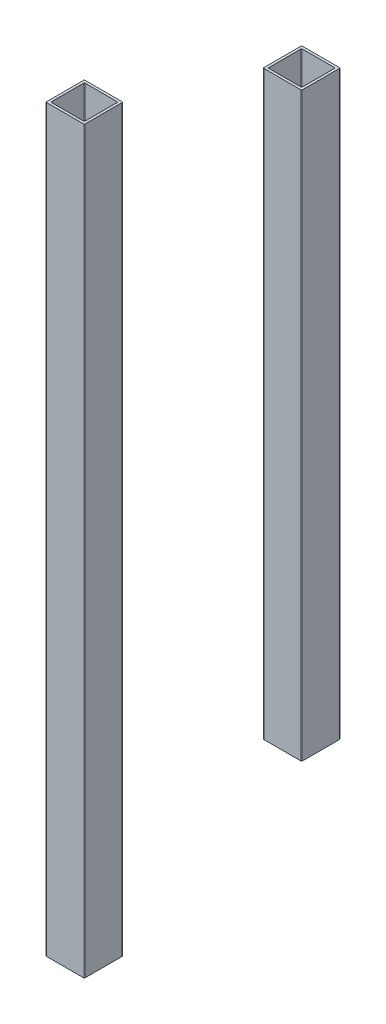
ISO-10303-21;
HEADER;
FILE_DESCRIPTION(('STEP AP214'),'2;1');
FILE_NAME('part.step','',(''),(''),'','','');
FILE_SCHEMA(('AUTOMOTIVE_DESIGN { 1 0 10303 214 1 1 1 1 }'));
ENDSEC;
DATA;
#1=APPLICATION_CONTEXT('core data for automotive mechanical design processes');
#2=APPLICATION_PROTOCOL_DEFINITION('international standard','automotive_design',2000,#1);
#3=PRODUCT_CONTEXT('',#1,'mechanical');
#4=PRODUCT('Part','Part','',(#3));
#5=PRODUCT_RELATED_PRODUCT_CATEGORY('part','',(#4));
#6=PRODUCT_DEFINITION_FORMATION('','',#4);
#7=PRODUCT_DEFINITION_CONTEXT('part definition',#1,'design');
#8=PRODUCT_DEFINITION('design','',#6,#7);
#9=PRODUCT_DEFINITION_SHAPE('','',#8);
#10=(LENGTH_UNIT() NAMED_UNIT(*) SI_UNIT(.MILLI.,.METRE.));
#11=(NAMED_UNIT(*) PLANE_ANGLE_UNIT() SI_UNIT($,.RADIAN.));
#12=(NAMED_UNIT(*) SI_UNIT($,.STERADIAN.) SOLID_ANGLE_UNIT());
#13=UNCERTAINTY_MEASURE_WITH_UNIT(LENGTH_MEASURE(1.E-05),#10,'distance_accuracy_value','');
#14=(GEOMETRIC_REPRESENTATION_CONTEXT(3) GLOBAL_UNCERTAINTY_ASSIGNED_CONTEXT((#13)) GLOBAL_UNIT_ASSIGNED_CONTEXT((#10,
#11,#12)) REPRESENTATION_CONTEXT('',''));
#15=CARTESIAN_POINT('',(0.,0.,0.));
#16=DIRECTION('',(0.,0.,1.));
#17=DIRECTION('',(1.,0.,0.));
#18=AXIS2_PLACEMENT_3D('',#15,#16,#17);
#19=CARTESIAN_POINT('',(-696.341,243.726115798,198.466817696));
#20=DIRECTION('',(0.,-1.,0.));
#21=DIRECTION('',(0.,0.,-1.));
#22=AXIS2_PLACEMENT_3D('',#19,#20,#21);
#23=CYLINDRICAL_SURFACE('',#22,0.507999999999974);
#24=CARTESIAN_POINT('',(-696.341,-243.726115798,198.466817696));
#25=DIRECTION('',(0.,1.,0.));
#26=DIRECTION('',(0.,0.,-1.));
#27=AXIS2_PLACEMENT_3D('',#24,#25,#26);
#28=CIRCLE('',#27,0.507999999999974);
#29=CARTESIAN_POINT('',(-696.341,-243.726115798,197.958817696));
#30=VERTEX_POINT('',#29);
#31=CARTESIAN_POINT('',(-696.849,-243.726115798,198.466817696));
#32=VERTEX_POINT('',#31);
#33=EDGE_CURVE('E240',#30,#32,#28,.T.);
#34=ORIENTED_EDGE('',*,*,#33,.F.);
#35=DIRECTION('',(0.,-1.,0.));
#36=VECTOR('',#35,1.);
#37=CARTESIAN_POINT('',(-696.341,243.726115798,197.958817696));
#38=LINE('',#37,#36);
#39=CARTESIAN_POINT('',(-696.341,243.726115798,197.958817696));
#40=VERTEX_POINT('',#39);
#41=EDGE_CURVE('E13',#40,#30,#38,.T.);
#42=ORIENTED_EDGE('',*,*,#41,.F.);
#43=CARTESIAN_POINT('',(-696.341,243.726115798,198.466817696));
#44=DIRECTION('',(0.,1.,0.));
#45=DIRECTION('',(0.,0.,-1.));
#46=AXIS2_PLACEMENT_3D('',#43,#44,#45);
#47=CIRCLE('',#46,0.507999999999974);
#48=CARTESIAN_POINT('',(-696.849,243.726115798,198.466817696));
#49=VERTEX_POINT('',#48);
#50=EDGE_CURVE('E325',#40,#49,#47,.T.);
#51=ORIENTED_EDGE('',*,*,#50,.T.);
#52=DIRECTION('',(0.,-1.,0.));
#53=VECTOR('',#52,1.);
#54=CARTESIAN_POINT('',(-696.849,243.726115798,198.466817696));
#55=LINE('',#54,#53);
#56=EDGE_CURVE('E92',#49,#32,#55,.T.);
#57=ORIENTED_EDGE('',*,*,#56,.T.);
#58=EDGE_LOOP('',(#34,#42,#51,#57));
#59=FACE_BOUND('',#58,.T.);
#60=ADVANCED_FACE('F73',(#59),#23,.F.);
#61=CARTESIAN_POINT('',(-675.259,243.726115798,197.958817696));
#62=DIRECTION('',(0.,0.,1.));
#63=DIRECTION('',(1.,0.,0.));
#64=AXIS2_PLACEMENT_3D('',#61,#62,#63);
#65=PLANE('',#64);
#66=DIRECTION('',(-1.,0.,0.));
#67=VECTOR('',#66,1.);
#68=CARTESIAN_POINT('',(-675.259,-243.726115798,197.958817696));
#69=LINE('',#68,#67);
#70=CARTESIAN_POINT('',(-675.259,-243.726115798,197.958817696));
#71=VERTEX_POINT('',#70);
#72=EDGE_CURVE('E242',#71,#30,#69,.T.);
#73=ORIENTED_EDGE('',*,*,#72,.F.);
#74=DIRECTION('',(0.,-1.,0.));
#75=VECTOR('',#74,1.);
#76=CARTESIAN_POINT('',(-675.259,243.726115798,197.958817696));
#77=LINE('',#76,#75);
#78=CARTESIAN_POINT('',(-675.259,243.726115798,197.958817696));
#79=VERTEX_POINT('',#78);
#80=EDGE_CURVE('E83',#79,#71,#77,.T.);
#81=ORIENTED_EDGE('',*,*,#80,.F.);
#82=DIRECTION('',(-1.,0.,0.));
#83=VECTOR('',#82,1.);
#84=CARTESIAN_POINT('',(-675.259,243.726115798,197.958817696));
#85=LINE('',#84,#83);
#86=EDGE_CURVE('E327',#79,#40,#85,.T.);
#87=ORIENTED_EDGE('',*,*,#86,.T.);
#88=ORIENTED_EDGE('',*,*,#41,.T.);
#89=EDGE_LOOP('',(#73,#81,#87,#88));
#90=FACE_BOUND('',#89,.T.);
#91=ADVANCED_FACE('F354',(#90),#65,.T.);
#92=CARTESIAN_POINT('',(-675.259,243.726115798,198.466817696));
#93=DIRECTION('',(0.,-1.,0.));
#94=DIRECTION('',(0.,0.,-1.));
#95=AXIS2_PLACEMENT_3D('',#92,#93,#94);
#96=CYLINDRICAL_SURFACE('',#95,0.507999999999974);
#97=CARTESIAN_POINT('',(-675.259,-243.726115798,198.466817696));
#98=DIRECTION('',(0.,1.,0.));
#99=DIRECTION('',(0.,0.,1.));
#100=AXIS2_PLACEMENT_3D('',#97,#98,#99);
#101=CIRCLE('',#100,0.507999999999974);
#102=CARTESIAN_POINT('',(-674.751,-243.726115798,198.466817696));
#103=VERTEX_POINT('',#102);
#104=EDGE_CURVE('E245',#103,#71,#101,.T.);
#105=ORIENTED_EDGE('',*,*,#104,.F.);
#106=DIRECTION('',(0.,-1.,0.));
#107=VECTOR('',#106,1.);
#108=CARTESIAN_POINT('',(-674.751,243.726115798,198.466817696));
#109=LINE('',#108,#107);
#110=CARTESIAN_POINT('',(-674.751,243.726115798,198.466817696));
#111=VERTEX_POINT('',#110);
#112=EDGE_CURVE('E266',#111,#103,#109,.T.);
#113=ORIENTED_EDGE('',*,*,#112,.F.);
#114=CARTESIAN_POINT('',(-675.259,243.726115798,198.466817696));
#115=DIRECTION('',(0.,1.,0.));
#116=DIRECTION('',(0.,0.,1.));
#117=AXIS2_PLACEMENT_3D('',#114,#115,#116);
#118=CIRCLE('',#117,0.507999999999974);
#119=EDGE_CURVE('E330',#111,#79,#118,.T.);
#120=ORIENTED_EDGE('',*,*,#119,.T.);
#121=ORIENTED_EDGE('',*,*,#80,.T.);
#122=EDGE_LOOP('',(#105,#113,#120,#121));
#123=FACE_BOUND('',#122,.T.);
#124=ADVANCED_FACE('F359',(#123),#96,.F.);
#125=CARTESIAN_POINT('',(-674.751,243.726115798,219.548817696));
#126=DIRECTION('',(-1.,0.,0.));
#127=DIRECTION('',(0.,0.,1.));
#128=AXIS2_PLACEMENT_3D('',#125,#126,#127);
#129=PLANE('',#128);
#130=DIRECTION('',(0.,0.,-1.));
#131=VECTOR('',#130,1.);
#132=CARTESIAN_POINT('',(-674.751,-243.726115798,219.548817696));
#133=LINE('',#132,#131);
#134=CARTESIAN_POINT('',(-674.751,-243.726115798,219.548817696));
#135=VERTEX_POINT('',#134);
#136=EDGE_CURVE('E248',#135,#103,#133,.T.);
#137=ORIENTED_EDGE('',*,*,#136,.F.);
#138=DIRECTION('',(0.,-1.,0.));
#139=VECTOR('',#138,1.);
#140=CARTESIAN_POINT('',(-674.751,243.726115798,219.548817696));
#141=LINE('',#140,#139);
#142=CARTESIAN_POINT('',(-674.751,243.726115798,219.548817696));
#143=VERTEX_POINT('',#142);
#144=EDGE_CURVE('E264',#143,#135,#141,.T.);
#145=ORIENTED_EDGE('',*,*,#144,.F.);
#146=DIRECTION('',(0.,0.,-1.));
#147=VECTOR('',#146,1.);
#148=CARTESIAN_POINT('',(-674.751,243.726115798,219.548817696));
#149=LINE('',#148,#147);
#150=EDGE_CURVE('E333',#143,#111,#149,.T.);
#151=ORIENTED_EDGE('',*,*,#150,.T.);
#152=ORIENTED_EDGE('',*,*,#112,.T.);
#153=EDGE_LOOP('',(#137,#145,#151,#152));
#154=FACE_BOUND('',#153,.T.);
#155=ADVANCED_FACE('F392',(#154),#129,.T.);
#156=CARTESIAN_POINT('',(-675.259,243.726115798,219.548817696));
#157=DIRECTION('',(0.,-1.,0.));
#158=DIRECTION('',(0.,0.,-1.));
#159=AXIS2_PLACEMENT_3D('',#156,#157,#158);
#160=CYLINDRICAL_SURFACE('',#159,0.507999999999974);
#161=CARTESIAN_POINT('',(-675.259,-243.726115798,219.548817696));
#162=DIRECTION('',(0.,1.,0.));
#163=DIRECTION('',(0.,0.,-1.));
#164=AXIS2_PLACEMENT_3D('',#161,#162,#163);
#165=CIRCLE('',#164,0.507999999999974);
#166=CARTESIAN_POINT('',(-675.259,-243.726115798,220.056817696));
#167=VERTEX_POINT('',#166);
#168=EDGE_CURVE('E251',#167,#135,#165,.T.);
#169=ORIENTED_EDGE('',*,*,#168,.F.);
#170=DIRECTION('',(0.,-1.,0.));
#171=VECTOR('',#170,1.);
#172=CARTESIAN_POINT('',(-675.259,243.726115798,220.056817696));
#173=LINE('',#172,#171);
#174=CARTESIAN_POINT('',(-675.259,243.726115798,220.056817696));
#175=VERTEX_POINT('',#174);
#176=EDGE_CURVE('E203',#175,#167,#173,.T.);
#177=ORIENTED_EDGE('',*,*,#176,.F.);
#178=CARTESIAN_POINT('',(-675.259,243.726115798,219.548817696));
#179=DIRECTION('',(0.,1.,0.));
#180=DIRECTION('',(0.,0.,-1.));
#181=AXIS2_PLACEMENT_3D('',#178,#179,#180);
#182=CIRCLE('',#181,0.507999999999974);
#183=EDGE_CURVE('E214',#175,#143,#182,.T.);
#184=ORIENTED_EDGE('',*,*,#183,.T.);
#185=ORIENTED_EDGE('',*,*,#144,.T.);
#186=EDGE_LOOP('',(#169,#177,#184,#185));
#187=FACE_BOUND('',#186,.T.);
#188=ADVANCED_FACE('F337',(#187),#160,.F.);
#189=CARTESIAN_POINT('',(-675.259,243.726115798,220.056817696));
#190=DIRECTION('',(0.,0.,-1.));
#191=DIRECTION('',(-1.,0.,0.));
#192=AXIS2_PLACEMENT_3D('',#189,#190,#191);
#193=PLANE('',#192);
#194=DIRECTION('',(1.,0.,0.));
#195=VECTOR('',#194,1.);
#196=CARTESIAN_POINT('',(-675.259,-243.726115798,220.056817696));
#197=LINE('',#196,#195);
#198=CARTESIAN_POINT('',(-696.341,-243.726115798,220.056817696));
#199=VERTEX_POINT('',#198);
#200=EDGE_CURVE('E199',#199,#167,#197,.T.);
#201=ORIENTED_EDGE('',*,*,#200,.F.);
#202=DIRECTION('',(0.,-1.,0.));
#203=VECTOR('',#202,1.);
#204=CARTESIAN_POINT('',(-696.341,243.726115798,220.056817696));
#205=LINE('',#204,#203);
#206=CARTESIAN_POINT('',(-696.341,243.726115798,220.056817696));
#207=VERTEX_POINT('',#206);
#208=EDGE_CURVE('E194',#207,#199,#205,.T.);
#209=ORIENTED_EDGE('',*,*,#208,.F.);
#210=DIRECTION('',(1.,0.,0.));
#211=VECTOR('',#210,1.);
#212=CARTESIAN_POINT('',(-675.259,243.726115798,220.056817696));
#213=LINE('',#212,#211);
#214=EDGE_CURVE('E197',#207,#175,#213,.T.);
#215=ORIENTED_EDGE('',*,*,#214,.T.);
#216=ORIENTED_EDGE('',*,*,#176,.T.);
#217=EDGE_LOOP('',(#201,#209,#215,#216));
#218=FACE_BOUND('',#217,.T.);
#219=ADVANCED_FACE('F196',(#218),#193,.T.);
#220=CARTESIAN_POINT('',(-696.341,243.726115798,219.548817696));
#221=DIRECTION('',(0.,-1.,0.));
#222=DIRECTION('',(0.,0.,-1.));
#223=AXIS2_PLACEMENT_3D('',#220,#221,#222);
#224=CYLINDRICAL_SURFACE('',#223,0.507999999999977);
#225=CARTESIAN_POINT('',(-696.341,-243.726115798,219.548817696));
#226=DIRECTION('',(0.,1.,0.));
#227=DIRECTION('',(0.,0.,-1.));
#228=AXIS2_PLACEMENT_3D('',#225,#226,#227);
#229=CIRCLE('',#228,0.507999999999977);
#230=CARTESIAN_POINT('',(-696.849,-243.726115798,219.548817696));
#231=VERTEX_POINT('',#230);
#232=EDGE_CURVE('E255',#231,#199,#229,.T.);
#233=ORIENTED_EDGE('',*,*,#232,.F.);
#234=DIRECTION('',(0.,-1.,0.));
#235=VECTOR('',#234,1.);
#236=CARTESIAN_POINT('',(-696.849,243.726115798,219.548817696));
#237=LINE('',#236,#235);
#238=CARTESIAN_POINT('',(-696.849,243.726115798,219.548817696));
#239=VERTEX_POINT('',#238);
#240=EDGE_CURVE('E141',#239,#231,#237,.T.);
#241=ORIENTED_EDGE('',*,*,#240,.F.);
#242=CARTESIAN_POINT('',(-696.341,243.726115798,219.548817696));
#243=DIRECTION('',(0.,1.,0.));
#244=DIRECTION('',(0.,0.,-1.));
#245=AXIS2_PLACEMENT_3D('',#242,#243,#244);
#246=CIRCLE('',#245,0.507999999999977);
#247=EDGE_CURVE('E211',#239,#207,#246,.T.);
#248=ORIENTED_EDGE('',*,*,#247,.T.);
#249=ORIENTED_EDGE('',*,*,#208,.T.);
#250=EDGE_LOOP('',(#233,#241,#248,#249));
#251=FACE_BOUND('',#250,.T.);
#252=ADVANCED_FACE('F216',(#251),#224,.F.);
#253=CARTESIAN_POINT('',(-697.992,243.726115798,196.815817696));
#254=DIRECTION('',(0.,-1.,0.));
#255=DIRECTION('',(0.,0.,-1.));
#256=AXIS2_PLACEMENT_3D('',#253,#254,#255);
#257=CYLINDRICAL_SURFACE('',#256,0.508000000000036);
#258=CARTESIAN_POINT('',(-697.992,-243.726115798,196.815817696));
#259=DIRECTION('',(0.,1.,0.));
#260=DIRECTION('',(0.,0.,-1.));
#261=AXIS2_PLACEMENT_3D('',#258,#259,#260);
#262=CIRCLE('',#261,0.508000000000036);
#263=CARTESIAN_POINT('',(-697.992,-243.726115798,196.307817696));
#264=VERTEX_POINT('',#263);
#265=CARTESIAN_POINT('',(-698.5,-243.726115798,196.815817696));
#266=VERTEX_POINT('',#265);
#267=EDGE_CURVE('E223',#264,#266,#262,.T.);
#268=ORIENTED_EDGE('',*,*,#267,.T.);
#269=DIRECTION('',(0.,-1.,0.));
#270=VECTOR('',#269,1.);
#271=CARTESIAN_POINT('',(-698.5,243.726115798,196.815817696));
#272=LINE('',#271,#270);
#273=CARTESIAN_POINT('',(-698.5,243.726115798,196.815817696));
#274=VERTEX_POINT('',#273);
#275=EDGE_CURVE('E77',#274,#266,#272,.T.);
#276=ORIENTED_EDGE('',*,*,#275,.F.);
#277=CARTESIAN_POINT('',(-697.992,243.726115798,196.815817696));
#278=DIRECTION('',(0.,1.,0.));
#279=DIRECTION('',(0.,0.,-1.));
#280=AXIS2_PLACEMENT_3D('',#277,#278,#279);
#281=CIRCLE('',#280,0.508000000000036);
#282=CARTESIAN_POINT('',(-697.992,243.726115798,196.307817696));
#283=VERTEX_POINT('',#282);
#284=EDGE_CURVE('E260',#283,#274,#281,.T.);
#285=ORIENTED_EDGE('',*,*,#284,.F.);
#286=DIRECTION('',(0.,-1.,0.));
#287=VECTOR('',#286,1.);
#288=CARTESIAN_POINT('',(-697.992,243.726115798,196.307817696));
#289=LINE('',#288,#287);
#290=EDGE_CURVE('E219',#283,#264,#289,.T.);
#291=ORIENTED_EDGE('',*,*,#290,.T.);
#292=EDGE_LOOP('',(#268,#276,#285,#291));
#293=FACE_BOUND('',#292,.T.);
#294=ADVANCED_FACE('F75',(#293),#257,.T.);
#295=CARTESIAN_POINT('',(-698.5,243.726115798,221.199817696));
#296=DIRECTION('',(1.,0.,0.));
#297=DIRECTION('',(0.,0.,-1.));
#298=AXIS2_PLACEMENT_3D('',#295,#296,#297);
#299=PLANE('',#298);
#300=DIRECTION('',(0.,0.,1.));
#301=VECTOR('',#300,1.);
#302=CARTESIAN_POINT('',(-698.5,-243.726115798,221.199817696));
#303=LINE('',#302,#301);
#304=CARTESIAN_POINT('',(-698.5,-243.726115798,221.199817696));
#305=VERTEX_POINT('',#304);
#306=EDGE_CURVE('E226',#266,#305,#303,.T.);
#307=ORIENTED_EDGE('',*,*,#306,.T.);
#308=DIRECTION('',(0.,-1.,0.));
#309=VECTOR('',#308,1.);
#310=CARTESIAN_POINT('',(-698.5,243.726115798,221.199817696));
#311=LINE('',#310,#309);
#312=CARTESIAN_POINT('',(-698.5,243.726115798,221.199817696));
#313=VERTEX_POINT('',#312);
#314=EDGE_CURVE('E285',#313,#305,#311,.T.);
#315=ORIENTED_EDGE('',*,*,#314,.F.);
#316=DIRECTION('',(0.,0.,1.));
#317=VECTOR('',#316,1.);
#318=CARTESIAN_POINT('',(-698.5,243.726115798,221.199817696));
#319=LINE('',#318,#317);
#320=EDGE_CURVE('E154',#274,#313,#319,.T.);
#321=ORIENTED_EDGE('',*,*,#320,.F.);
#322=ORIENTED_EDGE('',*,*,#275,.T.);
#323=EDGE_LOOP('',(#307,#315,#321,#322));
#324=FACE_BOUND('',#323,.T.);
#325=ADVANCED_FACE('F291',(#324),#299,.F.);
#326=CARTESIAN_POINT('',(-697.992,243.726115798,221.199817696));
#327=DIRECTION('',(0.,-1.,0.));
#328=DIRECTION('',(0.,0.,-1.));
#329=AXIS2_PLACEMENT_3D('',#326,#327,#328);
#330=CYLINDRICAL_SURFACE('',#329,0.508000000000033);
#331=CARTESIAN_POINT('',(-697.992,-243.726115798,221.199817696));
#332=DIRECTION('',(0.,1.,0.));
#333=DIRECTION('',(0.,0.,-1.));
#334=AXIS2_PLACEMENT_3D('',#331,#332,#333);
#335=CIRCLE('',#334,0.508000000000033);
#336=CARTESIAN_POINT('',(-697.992,-243.726115798,221.707817696));
#337=VERTEX_POINT('',#336);
#338=EDGE_CURVE('E228',#305,#337,#335,.T.);
#339=ORIENTED_EDGE('',*,*,#338,.T.);
#340=DIRECTION('',(0.,-1.,0.));
#341=VECTOR('',#340,1.);
#342=CARTESIAN_POINT('',(-697.992,243.726115798,221.707817696));
#343=LINE('',#342,#341);
#344=CARTESIAN_POINT('',(-697.992,243.726115798,221.707817696));
#345=VERTEX_POINT('',#344);
#346=EDGE_CURVE('E283',#345,#337,#343,.T.);
#347=ORIENTED_EDGE('',*,*,#346,.F.);
#348=CARTESIAN_POINT('',(-697.992,243.726115798,221.199817696));
#349=DIRECTION('',(0.,1.,0.));
#350=DIRECTION('',(0.,0.,-1.));
#351=AXIS2_PLACEMENT_3D('',#348,#349,#350);
#352=CIRCLE('',#351,0.508000000000033);
#353=EDGE_CURVE('E313',#313,#345,#352,.T.);
#354=ORIENTED_EDGE('',*,*,#353,.F.);
#355=ORIENTED_EDGE('',*,*,#314,.T.);
#356=EDGE_LOOP('',(#339,#347,#354,#355));
#357=FACE_BOUND('',#356,.T.);
#358=ADVANCED_FACE('F304',(#357),#330,.T.);
#359=CARTESIAN_POINT('',(-673.608,243.726115798,221.707817696));
#360=DIRECTION('',(0.,0.,-1.));
#361=DIRECTION('',(-1.,0.,0.));
#362=AXIS2_PLACEMENT_3D('',#359,#360,#361);
#363=PLANE('',#362);
#364=DIRECTION('',(1.,0.,0.));
#365=VECTOR('',#364,1.);
#366=CARTESIAN_POINT('',(-673.608,-243.726115798,221.707817696));
#367=LINE('',#366,#365);
#368=CARTESIAN_POINT('',(-673.608,-243.726115798,221.707817696));
#369=VERTEX_POINT('',#368);
#370=EDGE_CURVE('E230',#337,#369,#367,.T.);
#371=ORIENTED_EDGE('',*,*,#370,.T.);
#372=DIRECTION('',(0.,-1.,0.));
#373=VECTOR('',#372,1.);
#374=CARTESIAN_POINT('',(-673.608,243.726115798,221.707817696));
#375=LINE('',#374,#373);
#376=CARTESIAN_POINT('',(-673.608,243.726115798,221.707817696));
#377=VERTEX_POINT('',#376);
#378=EDGE_CURVE('E280',#377,#369,#375,.T.);
#379=ORIENTED_EDGE('',*,*,#378,.F.);
#380=DIRECTION('',(1.,0.,0.));
#381=VECTOR('',#380,1.);
#382=CARTESIAN_POINT('',(-673.608,243.726115798,221.707817696));
#383=LINE('',#382,#381);
#384=EDGE_CURVE('E309',#345,#377,#383,.T.);
#385=ORIENTED_EDGE('',*,*,#384,.F.);
#386=ORIENTED_EDGE('',*,*,#346,.T.);
#387=EDGE_LOOP('',(#371,#379,#385,#386));
#388=FACE_BOUND('',#387,.T.);
#389=ADVANCED_FACE('F307',(#388),#363,.F.);
#390=CARTESIAN_POINT('',(-673.608,243.726115798,221.199817696));
#391=DIRECTION('',(0.,-1.,0.));
#392=DIRECTION('',(0.,0.,-1.));
#393=AXIS2_PLACEMENT_3D('',#390,#391,#392);
#394=CYLINDRICAL_SURFACE('',#393,0.508000000000029);
#395=CARTESIAN_POINT('',(-673.608,-243.726115798,221.199817696));
#396=DIRECTION('',(0.,1.,0.));
#397=DIRECTION('',(0.,0.,-1.));
#398=AXIS2_PLACEMENT_3D('',#395,#396,#397);
#399=CIRCLE('',#398,0.508000000000029);
#400=CARTESIAN_POINT('',(-673.1,-243.726115798,221.199817696));
#401=VERTEX_POINT('',#400);
#402=EDGE_CURVE('E232',#369,#401,#399,.T.);
#403=ORIENTED_EDGE('',*,*,#402,.T.);
#404=DIRECTION('',(0.,-1.,0.));
#405=VECTOR('',#404,1.);
#406=CARTESIAN_POINT('',(-673.1,243.726115798,221.199817696));
#407=LINE('',#406,#405);
#408=CARTESIAN_POINT('',(-673.1,243.726115798,221.199817696));
#409=VERTEX_POINT('',#408);
#410=EDGE_CURVE('E277',#409,#401,#407,.T.);
#411=ORIENTED_EDGE('',*,*,#410,.F.);
#412=CARTESIAN_POINT('',(-673.608,243.726115798,221.199817696));
#413=DIRECTION('',(0.,1.,0.));
#414=DIRECTION('',(0.,0.,-1.));
#415=AXIS2_PLACEMENT_3D('',#412,#413,#414);
#416=CIRCLE('',#415,0.508000000000029);
#417=EDGE_CURVE('E312',#377,#409,#416,.T.);
#418=ORIENTED_EDGE('',*,*,#417,.F.);
#419=ORIENTED_EDGE('',*,*,#378,.T.);
#420=EDGE_LOOP('',(#403,#411,#418,#419));
#421=FACE_BOUND('',#420,.T.);
#422=ADVANCED_FACE('F370',(#421),#394,.T.);
#423=CARTESIAN_POINT('',(-673.1,243.726115798,221.199817696));
#424=DIRECTION('',(-1.,0.,0.));
#425=DIRECTION('',(0.,0.,1.));
#426=AXIS2_PLACEMENT_3D('',#423,#424,#425);
#427=PLANE('',#426);
#428=DIRECTION('',(0.,0.,-1.));
#429=VECTOR('',#428,1.);
#430=CARTESIAN_POINT('',(-673.1,-243.726115798,221.199817696));
#431=LINE('',#430,#429);
#432=CARTESIAN_POINT('',(-673.1,-243.726115798,196.815817696));
#433=VERTEX_POINT('',#432);
#434=EDGE_CURVE('E234',#401,#433,#431,.T.);
#435=ORIENTED_EDGE('',*,*,#434,.T.);
#436=DIRECTION('',(0.,-1.,0.));
#437=VECTOR('',#436,1.);
#438=CARTESIAN_POINT('',(-673.1,243.726115798,196.815817696));
#439=LINE('',#438,#437);
#440=CARTESIAN_POINT('',(-673.1,243.726115798,196.815817696));
#441=VERTEX_POINT('',#440);
#442=EDGE_CURVE('E274',#441,#433,#439,.T.);
#443=ORIENTED_EDGE('',*,*,#442,.F.);
#444=DIRECTION('',(0.,0.,-1.));
#445=VECTOR('',#444,1.);
#446=CARTESIAN_POINT('',(-673.1,243.726115798,221.199817696));
#447=LINE('',#446,#445);
#448=EDGE_CURVE('E315',#409,#441,#447,.T.);
#449=ORIENTED_EDGE('',*,*,#448,.F.);
#450=ORIENTED_EDGE('',*,*,#410,.T.);
#451=EDGE_LOOP('',(#435,#443,#449,#450));
#452=FACE_BOUND('',#451,.T.);
#453=ADVANCED_FACE('F366',(#452),#427,.F.);
#454=CARTESIAN_POINT('',(-673.608,243.726115798,196.815817696));
#455=DIRECTION('',(0.,-1.,0.));
#456=DIRECTION('',(0.,0.,-1.));
#457=AXIS2_PLACEMENT_3D('',#454,#455,#456);
#458=CYLINDRICAL_SURFACE('',#457,0.508000000000029);
#459=CARTESIAN_POINT('',(-673.608,-243.726115798,196.815817696));
#460=DIRECTION('',(0.,1.,0.));
#461=DIRECTION('',(0.,0.,1.));
#462=AXIS2_PLACEMENT_3D('',#459,#460,#461);
#463=CIRCLE('',#462,0.508000000000029);
#464=CARTESIAN_POINT('',(-673.608,-243.726115798,196.307817696));
#465=VERTEX_POINT('',#464);
#466=EDGE_CURVE('E236',#433,#465,#463,.T.);
#467=ORIENTED_EDGE('',*,*,#466,.T.);
#468=DIRECTION('',(0.,-1.,0.));
#469=VECTOR('',#468,1.);
#470=CARTESIAN_POINT('',(-673.608,243.726115798,196.307817696));
#471=LINE('',#470,#469);
#472=CARTESIAN_POINT('',(-673.608,243.726115798,196.307817696));
#473=VERTEX_POINT('',#472);
#474=EDGE_CURVE('E271',#473,#465,#471,.T.);
#475=ORIENTED_EDGE('',*,*,#474,.F.);
#476=CARTESIAN_POINT('',(-673.608,243.726115798,196.815817696));
#477=DIRECTION('',(0.,1.,0.));
#478=DIRECTION('',(0.,0.,1.));
#479=AXIS2_PLACEMENT_3D('',#476,#477,#478);
#480=CIRCLE('',#479,0.508000000000029);
#481=EDGE_CURVE('E321',#441,#473,#480,.T.);
#482=ORIENTED_EDGE('',*,*,#481,.F.);
#483=ORIENTED_EDGE('',*,*,#442,.T.);
#484=EDGE_LOOP('',(#467,#475,#482,#483));
#485=FACE_BOUND('',#484,.T.);
#486=ADVANCED_FACE('F348',(#485),#458,.T.);
#487=CARTESIAN_POINT('',(-673.608,243.726115798,196.307817696));
#488=DIRECTION('',(0.,0.,1.));
#489=DIRECTION('',(1.,0.,0.));
#490=AXIS2_PLACEMENT_3D('',#487,#488,#489);
#491=PLANE('',#490);
#492=DIRECTION('',(-1.,0.,0.));
#493=VECTOR('',#492,1.);
#494=CARTESIAN_POINT('',(-673.608,-243.726115798,196.307817696));
#495=LINE('',#494,#493);
#496=EDGE_CURVE('E238',#465,#264,#495,.T.);
#497=ORIENTED_EDGE('',*,*,#496,.T.);
#498=ORIENTED_EDGE('',*,*,#290,.F.);
#499=DIRECTION('',(-1.,0.,0.));
#500=VECTOR('',#499,1.);
#501=CARTESIAN_POINT('',(-673.608,243.726115798,196.307817696));
#502=LINE('',#501,#500);
#503=EDGE_CURVE('E323',#473,#283,#502,.T.);
#504=ORIENTED_EDGE('',*,*,#503,.F.);
#505=ORIENTED_EDGE('',*,*,#474,.T.);
#506=EDGE_LOOP('',(#497,#498,#504,#505));
#507=FACE_BOUND('',#506,.T.);
#508=ADVANCED_FACE('F341',(#507),#491,.F.);
#509=CARTESIAN_POINT('',(-696.849,243.726115798,219.548817696));
#510=DIRECTION('',(1.,0.,0.));
#511=DIRECTION('',(0.,0.,-1.));
#512=AXIS2_PLACEMENT_3D('',#509,#510,#511);
#513=PLANE('',#512);
#514=DIRECTION('',(0.,0.,1.));
#515=VECTOR('',#514,1.);
#516=CARTESIAN_POINT('',(-696.849,-243.726115798,219.548817696));
#517=LINE('',#516,#515);
#518=EDGE_CURVE('E257',#32,#231,#517,.T.);
#519=ORIENTED_EDGE('',*,*,#518,.F.);
#520=ORIENTED_EDGE('',*,*,#56,.F.);
#521=DIRECTION('',(0.,0.,1.));
#522=VECTOR('',#521,1.);
#523=CARTESIAN_POINT('',(-696.849,243.726115798,219.548817696));
#524=LINE('',#523,#522);
#525=EDGE_CURVE('E217',#49,#239,#524,.T.);
#526=ORIENTED_EDGE('',*,*,#525,.T.);
#527=ORIENTED_EDGE('',*,*,#240,.T.);
#528=EDGE_LOOP('',(#519,#520,#526,#527));
#529=FACE_BOUND('',#528,.T.);
#530=ADVANCED_FACE('F339',(#529),#513,.T.);
#531=CARTESIAN_POINT('',(-697.992,243.726115798,196.815817696));
#532=DIRECTION('',(0.,-1.,0.));
#533=DIRECTION('',(0.,0.,-1.));
#534=AXIS2_PLACEMENT_3D('',#531,#532,#533);
#535=PLANE('',#534);
#536=ORIENTED_EDGE('',*,*,#284,.T.);
#537=ORIENTED_EDGE('',*,*,#320,.T.);
#538=ORIENTED_EDGE('',*,*,#353,.T.);
#539=ORIENTED_EDGE('',*,*,#384,.T.);
#540=ORIENTED_EDGE('',*,*,#417,.T.);
#541=ORIENTED_EDGE('',*,*,#448,.T.);
#542=ORIENTED_EDGE('',*,*,#481,.T.);
#543=ORIENTED_EDGE('',*,*,#503,.T.);
#544=EDGE_LOOP('',(#536,#537,#538,#539,#540,#541,#542,#543));
#545=FACE_BOUND('',#544,.T.);
#546=ORIENTED_EDGE('',*,*,#50,.F.);
#547=ORIENTED_EDGE('',*,*,#86,.F.);
#548=ORIENTED_EDGE('',*,*,#119,.F.);
#549=ORIENTED_EDGE('',*,*,#150,.F.);
#550=ORIENTED_EDGE('',*,*,#183,.F.);
#551=ORIENTED_EDGE('',*,*,#214,.F.);
#552=ORIENTED_EDGE('',*,*,#247,.F.);
#553=ORIENTED_EDGE('',*,*,#525,.F.);
#554=EDGE_LOOP('',(#546,#547,#548,#549,#550,#551,#552,#553));
#555=FACE_BOUND('',#554,.T.);
#556=ADVANCED_FACE('F209',(#545,#555),#535,.F.);
#557=CARTESIAN_POINT('',(-697.992,-243.726115798,196.815817696));
#558=DIRECTION('',(0.,-1.,0.));
#559=DIRECTION('',(0.,0.,-1.));
#560=AXIS2_PLACEMENT_3D('',#557,#558,#559);
#561=PLANE('',#560);
#562=ORIENTED_EDGE('',*,*,#267,.F.);
#563=ORIENTED_EDGE('',*,*,#496,.F.);
#564=ORIENTED_EDGE('',*,*,#466,.F.);
#565=ORIENTED_EDGE('',*,*,#434,.F.);
#566=ORIENTED_EDGE('',*,*,#402,.F.);
#567=ORIENTED_EDGE('',*,*,#370,.F.);
#568=ORIENTED_EDGE('',*,*,#338,.F.);
#569=ORIENTED_EDGE('',*,*,#306,.F.);
#570=EDGE_LOOP('',(#562,#563,#564,#565,#566,#567,#568,#569));
#571=FACE_BOUND('',#570,.T.);
#572=ORIENTED_EDGE('',*,*,#33,.T.);
#573=ORIENTED_EDGE('',*,*,#518,.T.);
#574=ORIENTED_EDGE('',*,*,#232,.T.);
#575=ORIENTED_EDGE('',*,*,#200,.T.);
#576=ORIENTED_EDGE('',*,*,#168,.T.);
#577=ORIENTED_EDGE('',*,*,#136,.T.);
#578=ORIENTED_EDGE('',*,*,#104,.T.);
#579=ORIENTED_EDGE('',*,*,#72,.T.);
#580=EDGE_LOOP('',(#572,#573,#574,#575,#576,#577,#578,#579));
#581=FACE_BOUND('',#580,.T.);
#582=ADVANCED_FACE('F298',(#571,#581),#561,.T.);
#583=CLOSED_SHELL('',(#60,#91,#124,#155,#188,#219,#252,#294,#325,#358,#389,#422,#453,#486,#508,
#530,#556,#582));
#584=MANIFOLD_SOLID_BREP('B2',#583);
#585=CARTESIAN_POINT('',(-696.341,-191.578892686,76.275499214));
#586=DIRECTION('',(0.,1.,0.));
#587=DIRECTION('',(0.,0.,1.));
#588=AXIS2_PLACEMENT_3D('',#585,#586,#587);
#589=CYLINDRICAL_SURFACE('',#588,0.507999999999974);
#590=CARTESIAN_POINT('',(-696.341,191.578892686,76.275499214));
#591=DIRECTION('',(0.,-1.,0.));
#592=DIRECTION('',(0.,0.,1.));
#593=AXIS2_PLACEMENT_3D('',#590,#591,#592);
#594=CIRCLE('',#593,0.507999999999974);
#595=CARTESIAN_POINT('',(-696.341,191.578892686,76.7834992139999));
#596=VERTEX_POINT('',#595);
#597=CARTESIAN_POINT('',(-696.849,191.578892686,76.275499214));
#598=VERTEX_POINT('',#597);
#599=EDGE_CURVE('E714',#596,#598,#594,.T.);
#600=ORIENTED_EDGE('',*,*,#599,.F.);
#601=DIRECTION('',(0.,1.,0.));
#602=VECTOR('',#601,1.);
#603=CARTESIAN_POINT('',(-696.341,-191.578892686,76.783499214));
#604=LINE('',#603,#602);
#605=CARTESIAN_POINT('',(-696.341,-191.578892686,76.783499214));
#606=VERTEX_POINT('',#605);
#607=EDGE_CURVE('E71',#606,#596,#604,.T.);
#608=ORIENTED_EDGE('',*,*,#607,.F.);
#609=CARTESIAN_POINT('',(-696.341,-191.578892686,76.275499214));
#610=DIRECTION('',(0.,-1.,0.));
#611=DIRECTION('',(0.,0.,1.));
#612=AXIS2_PLACEMENT_3D('',#609,#610,#611);
#613=CIRCLE('',#612,0.507999999999974);
#614=CARTESIAN_POINT('',(-696.849,-191.578892686,76.275499214));
#615=VERTEX_POINT('',#614);
#616=EDGE_CURVE('E799',#606,#615,#613,.T.);
#617=ORIENTED_EDGE('',*,*,#616,.T.);
#618=DIRECTION('',(0.,1.,0.));
#619=VECTOR('',#618,1.);
#620=CARTESIAN_POINT('',(-696.849,-191.578892686,76.275499214));
#621=LINE('',#620,#619);
#622=EDGE_CURVE('E566',#615,#598,#621,.T.);
#623=ORIENTED_EDGE('',*,*,#622,.T.);
#624=EDGE_LOOP('',(#600,#608,#617,#623));
#625=FACE_BOUND('',#624,.T.);
#626=ADVANCED_FACE('F547',(#625),#589,.F.);
#627=CARTESIAN_POINT('',(-675.259,-191.578892686,76.783499214));
#628=DIRECTION('',(0.,0.,-1.));
#629=DIRECTION('',(0.,1.,0.));
#630=AXIS2_PLACEMENT_3D('',#627,#628,#629);
#631=PLANE('',#630);
#632=DIRECTION('',(-1.,0.,0.));
#633=VECTOR('',#632,1.);
#634=CARTESIAN_POINT('',(-675.259,191.578892686,76.7834992139999));
#635=LINE('',#634,#633);
#636=CARTESIAN_POINT('',(-675.259,191.578892686,76.7834992139999));
#637=VERTEX_POINT('',#636);
#638=EDGE_CURVE('E716',#637,#596,#635,.T.);
#639=ORIENTED_EDGE('',*,*,#638,.F.);
#640=DIRECTION('',(0.,1.,0.));
#641=VECTOR('',#640,1.);
#642=CARTESIAN_POINT('',(-675.259,-191.578892686,76.783499214));
#643=LINE('',#642,#641);
#644=CARTESIAN_POINT('',(-675.259,-191.578892686,76.783499214));
#645=VERTEX_POINT('',#644);
#646=EDGE_CURVE('E557',#645,#637,#643,.T.);
#647=ORIENTED_EDGE('',*,*,#646,.F.);
#648=DIRECTION('',(-1.,0.,0.));
#649=VECTOR('',#648,1.);
#650=CARTESIAN_POINT('',(-675.259,-191.578892686,76.783499214));
#651=LINE('',#650,#649);
#652=EDGE_CURVE('E801',#645,#606,#651,.T.);
#653=ORIENTED_EDGE('',*,*,#652,.T.);
#654=ORIENTED_EDGE('',*,*,#607,.T.);
#655=EDGE_LOOP('',(#639,#647,#653,#654));
#656=FACE_BOUND('',#655,.T.);
#657=ADVANCED_FACE('F828',(#656),#631,.T.);
#658=CARTESIAN_POINT('',(-675.259,-191.578892686,76.275499214));
#659=DIRECTION('',(0.,1.,0.));
#660=DIRECTION('',(0.,0.,1.));
#661=AXIS2_PLACEMENT_3D('',#658,#659,#660);
#662=CYLINDRICAL_SURFACE('',#661,0.507999999999974);
#663=CARTESIAN_POINT('',(-675.259,191.578892686,76.275499214));
#664=DIRECTION('',(0.,-1.,0.));
#665=DIRECTION('',(0.,0.,-1.));
#666=AXIS2_PLACEMENT_3D('',#663,#664,#665);
#667=CIRCLE('',#666,0.507999999999974);
#668=CARTESIAN_POINT('',(-674.751,191.578892686,76.275499214));
#669=VERTEX_POINT('',#668);
#670=EDGE_CURVE('E719',#669,#637,#667,.T.);
#671=ORIENTED_EDGE('',*,*,#670,.F.);
#672=DIRECTION('',(0.,1.,0.));
#673=VECTOR('',#672,1.);
#674=CARTESIAN_POINT('',(-674.751,-191.578892686,76.275499214));
#675=LINE('',#674,#673);
#676=CARTESIAN_POINT('',(-674.751,-191.578892686,76.275499214));
#677=VERTEX_POINT('',#676);
#678=EDGE_CURVE('E740',#677,#669,#675,.T.);
#679=ORIENTED_EDGE('',*,*,#678,.F.);
#680=CARTESIAN_POINT('',(-675.259,-191.578892686,76.275499214));
#681=DIRECTION('',(0.,-1.,0.));
#682=DIRECTION('',(0.,0.,-1.));
#683=AXIS2_PLACEMENT_3D('',#680,#681,#682);
#684=CIRCLE('',#683,0.507999999999974);
#685=EDGE_CURVE('E804',#677,#645,#684,.T.);
#686=ORIENTED_EDGE('',*,*,#685,.T.);
#687=ORIENTED_EDGE('',*,*,#646,.T.);
#688=EDGE_LOOP('',(#671,#679,#686,#687));
#689=FACE_BOUND('',#688,.T.);
#690=ADVANCED_FACE('F833',(#689),#662,.F.);
#691=CARTESIAN_POINT('',(-674.751,-191.578892686,55.193499214));
#692=DIRECTION('',(-1.,0.,0.));
#693=DIRECTION('',(0.,0.,1.));
#694=AXIS2_PLACEMENT_3D('',#691,#692,#693);
#695=PLANE('',#694);
#696=DIRECTION('',(0.,0.,1.));
#697=VECTOR('',#696,1.);
#698=CARTESIAN_POINT('',(-674.751,191.578892686,55.193499214));
#699=LINE('',#698,#697);
#700=CARTESIAN_POINT('',(-674.751,191.578892686,55.193499214));
#701=VERTEX_POINT('',#700);
#702=EDGE_CURVE('E722',#701,#669,#699,.T.);
#703=ORIENTED_EDGE('',*,*,#702,.F.);
#704=DIRECTION('',(0.,1.,0.));
#705=VECTOR('',#704,1.);
#706=CARTESIAN_POINT('',(-674.751,-191.578892686,55.193499214));
#707=LINE('',#706,#705);
#708=CARTESIAN_POINT('',(-674.751,-191.578892686,55.193499214));
#709=VERTEX_POINT('',#708);
#710=EDGE_CURVE('E738',#709,#701,#707,.T.);
#711=ORIENTED_EDGE('',*,*,#710,.F.);
#712=DIRECTION('',(0.,0.,1.));
#713=VECTOR('',#712,1.);
#714=CARTESIAN_POINT('',(-674.751,-191.578892686,55.193499214));
#715=LINE('',#714,#713);
#716=EDGE_CURVE('E807',#709,#677,#715,.T.);
#717=ORIENTED_EDGE('',*,*,#716,.T.);
#718=ORIENTED_EDGE('',*,*,#678,.T.);
#719=EDGE_LOOP('',(#703,#711,#717,#718));
#720=FACE_BOUND('',#719,.T.);
#721=ADVANCED_FACE('F866',(#720),#695,.T.);
#722=CARTESIAN_POINT('',(-675.259,-191.578892686,55.193499214));
#723=DIRECTION('',(0.,1.,0.));
#724=DIRECTION('',(0.,0.,1.));
#725=AXIS2_PLACEMENT_3D('',#722,#723,#724);
#726=CYLINDRICAL_SURFACE('',#725,0.507999999999974);
#727=CARTESIAN_POINT('',(-675.259,191.578892686,55.1934992139999));
#728=DIRECTION('',(0.,-1.,0.));
#729=DIRECTION('',(0.,0.,1.));
#730=AXIS2_PLACEMENT_3D('',#727,#728,#729);
#731=CIRCLE('',#730,0.507999999999974);
#732=CARTESIAN_POINT('',(-675.259,191.578892686,54.685499214));
#733=VERTEX_POINT('',#732);
#734=EDGE_CURVE('E725',#733,#701,#731,.T.);
#735=ORIENTED_EDGE('',*,*,#734,.F.);
#736=DIRECTION('',(0.,1.,0.));
#737=VECTOR('',#736,1.);
#738=CARTESIAN_POINT('',(-675.259,-191.578892686,54.685499214));
#739=LINE('',#738,#737);
#740=CARTESIAN_POINT('',(-675.259,-191.578892686,54.685499214));
#741=VERTEX_POINT('',#740);
#742=EDGE_CURVE('E677',#741,#733,#739,.T.);
#743=ORIENTED_EDGE('',*,*,#742,.F.);
#744=CARTESIAN_POINT('',(-675.259,-191.578892686,55.193499214));
#745=DIRECTION('',(0.,-1.,0.));
#746=DIRECTION('',(0.,0.,1.));
#747=AXIS2_PLACEMENT_3D('',#744,#745,#746);
#748=CIRCLE('',#747,0.507999999999974);
#749=EDGE_CURVE('E688',#741,#709,#748,.T.);
#750=ORIENTED_EDGE('',*,*,#749,.T.);
#751=ORIENTED_EDGE('',*,*,#710,.T.);
#752=EDGE_LOOP('',(#735,#743,#750,#751));
#753=FACE_BOUND('',#752,.T.);
#754=ADVANCED_FACE('F811',(#753),#726,.F.);
#755=CARTESIAN_POINT('',(-675.259,-191.578892686,54.685499214));
#756=DIRECTION('',(0.,0.,1.));
#757=DIRECTION('',(0.,-1.,0.));
#758=AXIS2_PLACEMENT_3D('',#755,#756,#757);
#759=PLANE('',#758);
#760=DIRECTION('',(1.,0.,0.));
#761=VECTOR('',#760,1.);
#762=CARTESIAN_POINT('',(-675.259,191.578892686,54.685499214));
#763=LINE('',#762,#761);
#764=CARTESIAN_POINT('',(-696.341,191.578892686,54.685499214));
#765=VERTEX_POINT('',#764);
#766=EDGE_CURVE('E673',#765,#733,#763,.T.);
#767=ORIENTED_EDGE('',*,*,#766,.F.);
#768=DIRECTION('',(0.,1.,0.));
#769=VECTOR('',#768,1.);
#770=CARTESIAN_POINT('',(-696.341,-191.578892686,54.685499214));
#771=LINE('',#770,#769);
#772=CARTESIAN_POINT('',(-696.341,-191.578892686,54.685499214));
#773=VERTEX_POINT('',#772);
#774=EDGE_CURVE('E668',#773,#765,#771,.T.);
#775=ORIENTED_EDGE('',*,*,#774,.F.);
#776=DIRECTION('',(1.,0.,0.));
#777=VECTOR('',#776,1.);
#778=CARTESIAN_POINT('',(-675.259,-191.578892686,54.685499214));
#779=LINE('',#778,#777);
#780=EDGE_CURVE('E671',#773,#741,#779,.T.);
#781=ORIENTED_EDGE('',*,*,#780,.T.);
#782=ORIENTED_EDGE('',*,*,#742,.T.);
#783=EDGE_LOOP('',(#767,#775,#781,#782));
#784=FACE_BOUND('',#783,.T.);
#785=ADVANCED_FACE('F670',(#784),#759,.T.);
#786=CARTESIAN_POINT('',(-696.341,-191.578892686,55.193499214));
#787=DIRECTION('',(0.,1.,0.));
#788=DIRECTION('',(0.,0.,1.));
#789=AXIS2_PLACEMENT_3D('',#786,#787,#788);
#790=CYLINDRICAL_SURFACE('',#789,0.507999999999977);
#791=CARTESIAN_POINT('',(-696.341,191.578892686,55.193499214));
#792=DIRECTION('',(0.,-1.,0.));
#793=DIRECTION('',(0.,0.,1.));
#794=AXIS2_PLACEMENT_3D('',#791,#792,#793);
#795=CIRCLE('',#794,0.507999999999977);
#796=CARTESIAN_POINT('',(-696.849,191.578892686,55.193499214));
#797=VERTEX_POINT('',#796);
#798=EDGE_CURVE('E729',#797,#765,#795,.T.);
#799=ORIENTED_EDGE('',*,*,#798,.F.);
#800=DIRECTION('',(0.,1.,0.));
#801=VECTOR('',#800,1.);
#802=CARTESIAN_POINT('',(-696.849,-191.578892686,55.193499214));
#803=LINE('',#802,#801);
#804=CARTESIAN_POINT('',(-696.849,-191.578892686,55.193499214));
#805=VERTEX_POINT('',#804);
#806=EDGE_CURVE('E615',#805,#797,#803,.T.);
#807=ORIENTED_EDGE('',*,*,#806,.F.);
#808=CARTESIAN_POINT('',(-696.341,-191.578892686,55.193499214));
#809=DIRECTION('',(0.,-1.,0.));
#810=DIRECTION('',(0.,0.,1.));
#811=AXIS2_PLACEMENT_3D('',#808,#809,#810);
#812=CIRCLE('',#811,0.507999999999977);
#813=EDGE_CURVE('E685',#805,#773,#812,.T.);
#814=ORIENTED_EDGE('',*,*,#813,.T.);
#815=ORIENTED_EDGE('',*,*,#774,.T.);
#816=EDGE_LOOP('',(#799,#807,#814,#815));
#817=FACE_BOUND('',#816,.T.);
#818=ADVANCED_FACE('F690',(#817),#790,.F.);
#819=CARTESIAN_POINT('',(-697.992,-191.578892686,77.926499214));
#820=DIRECTION('',(0.,1.,0.));
#821=DIRECTION('',(0.,0.,1.));
#822=AXIS2_PLACEMENT_3D('',#819,#820,#821);
#823=CYLINDRICAL_SURFACE('',#822,0.508000000000036);
#824=CARTESIAN_POINT('',(-697.992,191.578892686,77.9264992139999));
#825=DIRECTION('',(0.,-1.,0.));
#826=DIRECTION('',(0.,0.,1.));
#827=AXIS2_PLACEMENT_3D('',#824,#825,#826);
#828=CIRCLE('',#827,0.508000000000036);
#829=CARTESIAN_POINT('',(-697.992,191.578892686,78.434499214));
#830=VERTEX_POINT('',#829);
#831=CARTESIAN_POINT('',(-698.5,191.578892686,77.9264992139999));
#832=VERTEX_POINT('',#831);
#833=EDGE_CURVE('E697',#830,#832,#828,.T.);
#834=ORIENTED_EDGE('',*,*,#833,.T.);
#835=DIRECTION('',(0.,1.,0.));
#836=VECTOR('',#835,1.);
#837=CARTESIAN_POINT('',(-698.5,-191.578892686,77.926499214));
#838=LINE('',#837,#836);
#839=CARTESIAN_POINT('',(-698.5,-191.578892686,77.926499214));
#840=VERTEX_POINT('',#839);
#841=EDGE_CURVE('E551',#840,#832,#838,.T.);
#842=ORIENTED_EDGE('',*,*,#841,.F.);
#843=CARTESIAN_POINT('',(-697.992,-191.578892686,77.926499214));
#844=DIRECTION('',(0.,-1.,0.));
#845=DIRECTION('',(0.,0.,1.));
#846=AXIS2_PLACEMENT_3D('',#843,#844,#845);
#847=CIRCLE('',#846,0.508000000000036);
#848=CARTESIAN_POINT('',(-697.992,-191.578892686,78.434499214));
#849=VERTEX_POINT('',#848);
#850=EDGE_CURVE('E734',#849,#840,#847,.T.);
#851=ORIENTED_EDGE('',*,*,#850,.F.);
#852=DIRECTION('',(0.,1.,0.));
#853=VECTOR('',#852,1.);
#854=CARTESIAN_POINT('',(-697.992,-191.578892686,78.434499214));
#855=LINE('',#854,#853);
#856=EDGE_CURVE('E693',#849,#830,#855,.T.);
#857=ORIENTED_EDGE('',*,*,#856,.T.);
#858=EDGE_LOOP('',(#834,#842,#851,#857));
#859=FACE_BOUND('',#858,.T.);
#860=ADVANCED_FACE('F549',(#859),#823,.T.);
#861=CARTESIAN_POINT('',(-698.5,-191.578892686,53.542499214));
#862=DIRECTION('',(1.,0.,0.));
#863=DIRECTION('',(0.,0.,-1.));
#864=AXIS2_PLACEMENT_3D('',#861,#862,#863);
#865=PLANE('',#864);
#866=DIRECTION('',(0.,0.,-1.));
#867=VECTOR('',#866,1.);
#868=CARTESIAN_POINT('',(-698.5,191.578892686,53.542499214));
#869=LINE('',#868,#867);
#870=CARTESIAN_POINT('',(-698.5,191.578892686,53.542499214));
#871=VERTEX_POINT('',#870);
#872=EDGE_CURVE('E700',#832,#871,#869,.T.);
#873=ORIENTED_EDGE('',*,*,#872,.T.);
#874=DIRECTION('',(0.,1.,0.));
#875=VECTOR('',#874,1.);
#876=CARTESIAN_POINT('',(-698.5,-191.578892686,53.542499214));
#877=LINE('',#876,#875);
#878=CARTESIAN_POINT('',(-698.5,-191.578892686,53.542499214));
#879=VERTEX_POINT('',#878);
#880=EDGE_CURVE('E759',#879,#871,#877,.T.);
#881=ORIENTED_EDGE('',*,*,#880,.F.);
#882=DIRECTION('',(0.,0.,-1.));
#883=VECTOR('',#882,1.);
#884=CARTESIAN_POINT('',(-698.5,-191.578892686,53.542499214));
#885=LINE('',#884,#883);
#886=EDGE_CURVE('E628',#840,#879,#885,.T.);
#887=ORIENTED_EDGE('',*,*,#886,.F.);
#888=ORIENTED_EDGE('',*,*,#841,.T.);
#889=EDGE_LOOP('',(#873,#881,#887,#888));
#890=FACE_BOUND('',#889,.T.);
#891=ADVANCED_FACE('F765',(#890),#865,.F.);
#892=CARTESIAN_POINT('',(-697.992,-191.578892686,53.542499214));
#893=DIRECTION('',(0.,1.,0.));
#894=DIRECTION('',(0.,0.,1.));
#895=AXIS2_PLACEMENT_3D('',#892,#893,#894);
#896=CYLINDRICAL_SURFACE('',#895,0.508000000000033);
#897=CARTESIAN_POINT('',(-697.992,191.578892686,53.542499214));
#898=DIRECTION('',(0.,-1.,0.));
#899=DIRECTION('',(0.,0.,1.));
#900=AXIS2_PLACEMENT_3D('',#897,#898,#899);
#901=CIRCLE('',#900,0.508000000000033);
#902=CARTESIAN_POINT('',(-697.992,191.578892686,53.0344992139999));
#903=VERTEX_POINT('',#902);
#904=EDGE_CURVE('E702',#871,#903,#901,.T.);
#905=ORIENTED_EDGE('',*,*,#904,.T.);
#906=DIRECTION('',(0.,1.,0.));
#907=VECTOR('',#906,1.);
#908=CARTESIAN_POINT('',(-697.992,-191.578892686,53.034499214));
#909=LINE('',#908,#907);
#910=CARTESIAN_POINT('',(-697.992,-191.578892686,53.034499214));
#911=VERTEX_POINT('',#910);
#912=EDGE_CURVE('E757',#911,#903,#909,.T.);
#913=ORIENTED_EDGE('',*,*,#912,.F.);
#914=CARTESIAN_POINT('',(-697.992,-191.578892686,53.542499214));
#915=DIRECTION('',(0.,-1.,0.));
#916=DIRECTION('',(0.,0.,1.));
#917=AXIS2_PLACEMENT_3D('',#914,#915,#916);
#918=CIRCLE('',#917,0.508000000000033);
#919=EDGE_CURVE('E787',#879,#911,#918,.T.);
#920=ORIENTED_EDGE('',*,*,#919,.F.);
#921=ORIENTED_EDGE('',*,*,#880,.T.);
#922=EDGE_LOOP('',(#905,#913,#920,#921));
#923=FACE_BOUND('',#922,.T.);
#924=ADVANCED_FACE('F778',(#923),#896,.T.);
#925=CARTESIAN_POINT('',(-673.608,-191.578892686,53.034499214));
#926=DIRECTION('',(0.,0.,1.));
#927=DIRECTION('',(0.,-1.,0.));
#928=AXIS2_PLACEMENT_3D('',#925,#926,#927);
#929=PLANE('',#928);
#930=DIRECTION('',(1.,0.,0.));
#931=VECTOR('',#930,1.);
#932=CARTESIAN_POINT('',(-673.608,191.578892686,53.034499214));
#933=LINE('',#932,#931);
#934=CARTESIAN_POINT('',(-673.608,191.578892686,53.034499214));
#935=VERTEX_POINT('',#934);
#936=EDGE_CURVE('E704',#903,#935,#933,.T.);
#937=ORIENTED_EDGE('',*,*,#936,.T.);
#938=DIRECTION('',(0.,1.,0.));
#939=VECTOR('',#938,1.);
#940=CARTESIAN_POINT('',(-673.608,-191.578892686,53.034499214));
#941=LINE('',#940,#939);
#942=CARTESIAN_POINT('',(-673.608,-191.578892686,53.034499214));
#943=VERTEX_POINT('',#942);
#944=EDGE_CURVE('E754',#943,#935,#941,.T.);
#945=ORIENTED_EDGE('',*,*,#944,.F.);
#946=DIRECTION('',(1.,0.,0.));
#947=VECTOR('',#946,1.);
#948=CARTESIAN_POINT('',(-673.608,-191.578892686,53.034499214));
#949=LINE('',#948,#947);
#950=EDGE_CURVE('E783',#911,#943,#949,.T.);
#951=ORIENTED_EDGE('',*,*,#950,.F.);
#952=ORIENTED_EDGE('',*,*,#912,.T.);
#953=EDGE_LOOP('',(#937,#945,#951,#952));
#954=FACE_BOUND('',#953,.T.);
#955=ADVANCED_FACE('F781',(#954),#929,.F.);
#956=CARTESIAN_POINT('',(-673.608,-191.578892686,53.542499214));
#957=DIRECTION('',(0.,1.,0.));
#958=DIRECTION('',(0.,0.,1.));
#959=AXIS2_PLACEMENT_3D('',#956,#957,#958);
#960=CYLINDRICAL_SURFACE('',#959,0.508000000000029);
#961=CARTESIAN_POINT('',(-673.608,191.578892686,53.542499214));
#962=DIRECTION('',(0.,-1.,0.));
#963=DIRECTION('',(0.,0.,1.));
#964=AXIS2_PLACEMENT_3D('',#961,#962,#963);
#965=CIRCLE('',#964,0.508000000000029);
#966=CARTESIAN_POINT('',(-673.1,191.578892686,53.542499214));
#967=VERTEX_POINT('',#966);
#968=EDGE_CURVE('E706',#935,#967,#965,.T.);
#969=ORIENTED_EDGE('',*,*,#968,.T.);
#970=DIRECTION('',(0.,1.,0.));
#971=VECTOR('',#970,1.);
#972=CARTESIAN_POINT('',(-673.1,-191.578892686,53.542499214));
#973=LINE('',#972,#971);
#974=CARTESIAN_POINT('',(-673.1,-191.578892686,53.542499214));
#975=VERTEX_POINT('',#974);
#976=EDGE_CURVE('E751',#975,#967,#973,.T.);
#977=ORIENTED_EDGE('',*,*,#976,.F.);
#978=CARTESIAN_POINT('',(-673.608,-191.578892686,53.542499214));
#979=DIRECTION('',(0.,-1.,0.));
#980=DIRECTION('',(0.,0.,1.));
#981=AXIS2_PLACEMENT_3D('',#978,#979,#980);
#982=CIRCLE('',#981,0.508000000000029);
#983=EDGE_CURVE('E786',#943,#975,#982,.T.);
#984=ORIENTED_EDGE('',*,*,#983,.F.);
#985=ORIENTED_EDGE('',*,*,#944,.T.);
#986=EDGE_LOOP('',(#969,#977,#984,#985));
#987=FACE_BOUND('',#986,.T.);
#988=ADVANCED_FACE('F844',(#987),#960,.T.);
#989=CARTESIAN_POINT('',(-673.1,-191.578892686,53.542499214));
#990=DIRECTION('',(-1.,0.,0.));
#991=DIRECTION('',(0.,0.,1.));
#992=AXIS2_PLACEMENT_3D('',#989,#990,#991);
#993=PLANE('',#992);
#994=DIRECTION('',(0.,0.,1.));
#995=VECTOR('',#994,1.);
#996=CARTESIAN_POINT('',(-673.1,191.578892686,53.542499214));
#997=LINE('',#996,#995);
#998=CARTESIAN_POINT('',(-673.1,191.578892686,77.9264992139999));
#999=VERTEX_POINT('',#998);
#1000=EDGE_CURVE('E708',#967,#999,#997,.T.);
#1001=ORIENTED_EDGE('',*,*,#1000,.T.);
#1002=DIRECTION('',(0.,1.,0.));
#1003=VECTOR('',#1002,1.);
#1004=CARTESIAN_POINT('',(-673.1,-191.578892686,77.926499214));
#1005=LINE('',#1004,#1003);
#1006=CARTESIAN_POINT('',(-673.1,-191.578892686,77.926499214));
#1007=VERTEX_POINT('',#1006);
#1008=EDGE_CURVE('E748',#1007,#999,#1005,.T.);
#1009=ORIENTED_EDGE('',*,*,#1008,.F.);
#1010=DIRECTION('',(0.,0.,1.));
#1011=VECTOR('',#1010,1.);
#1012=CARTESIAN_POINT('',(-673.1,-191.578892686,53.542499214));
#1013=LINE('',#1012,#1011);
#1014=EDGE_CURVE('E789',#975,#1007,#1013,.T.);
#1015=ORIENTED_EDGE('',*,*,#1014,.F.);
#1016=ORIENTED_EDGE('',*,*,#976,.T.);
#1017=EDGE_LOOP('',(#1001,#1009,#1015,#1016));
#1018=FACE_BOUND('',#1017,.T.);
#1019=ADVANCED_FACE('F840',(#1018),#993,.F.);
#1020=CARTESIAN_POINT('',(-673.608,-191.578892686,77.926499214));
#1021=DIRECTION('',(0.,1.,0.));
#1022=DIRECTION('',(0.,0.,1.));
#1023=AXIS2_PLACEMENT_3D('',#1020,#1021,#1022);
#1024=CYLINDRICAL_SURFACE('',#1023,0.508000000000029);
#1025=CARTESIAN_POINT('',(-673.608,191.578892686,77.9264992139999));
#1026=DIRECTION('',(0.,-1.,0.));
#1027=DIRECTION('',(0.,0.,-1.));
#1028=AXIS2_PLACEMENT_3D('',#1025,#1026,#1027);
#1029=CIRCLE('',#1028,0.508000000000029);
#1030=CARTESIAN_POINT('',(-673.608,191.578892686,78.434499214));
#1031=VERTEX_POINT('',#1030);
#1032=EDGE_CURVE('E710',#999,#1031,#1029,.T.);
#1033=ORIENTED_EDGE('',*,*,#1032,.T.);
#1034=DIRECTION('',(0.,1.,0.));
#1035=VECTOR('',#1034,1.);
#1036=CARTESIAN_POINT('',(-673.608,-191.578892686,78.434499214));
#1037=LINE('',#1036,#1035);
#1038=CARTESIAN_POINT('',(-673.608,-191.578892686,78.434499214));
#1039=VERTEX_POINT('',#1038);
#1040=EDGE_CURVE('E745',#1039,#1031,#1037,.T.);
#1041=ORIENTED_EDGE('',*,*,#1040,.F.);
#1042=CARTESIAN_POINT('',(-673.608,-191.578892686,77.926499214));
#1043=DIRECTION('',(0.,-1.,0.));
#1044=DIRECTION('',(0.,0.,-1.));
#1045=AXIS2_PLACEMENT_3D('',#1042,#1043,#1044);
#1046=CIRCLE('',#1045,0.508000000000029);
#1047=EDGE_CURVE('E795',#1007,#1039,#1046,.T.);
#1048=ORIENTED_EDGE('',*,*,#1047,.F.);
#1049=ORIENTED_EDGE('',*,*,#1008,.T.);
#1050=EDGE_LOOP('',(#1033,#1041,#1048,#1049));
#1051=FACE_BOUND('',#1050,.T.);
#1052=ADVANCED_FACE('F822',(#1051),#1024,.T.);
#1053=CARTESIAN_POINT('',(-673.608,-191.578892686,78.434499214));
#1054=DIRECTION('',(0.,0.,-1.));
#1055=DIRECTION('',(-1.,0.,0.));
#1056=AXIS2_PLACEMENT_3D('',#1053,#1054,#1055);
#1057=PLANE('',#1056);
#1058=DIRECTION('',(-1.,0.,0.));
#1059=VECTOR('',#1058,1.);
#1060=CARTESIAN_POINT('',(-673.608,191.578892686,78.4344992139999));
#1061=LINE('',#1060,#1059);
#1062=EDGE_CURVE('E712',#1031,#830,#1061,.T.);
#1063=ORIENTED_EDGE('',*,*,#1062,.T.);
#1064=ORIENTED_EDGE('',*,*,#856,.F.);
#1065=DIRECTION('',(-1.,0.,0.));
#1066=VECTOR('',#1065,1.);
#1067=CARTESIAN_POINT('',(-673.608,-191.578892686,78.434499214));
#1068=LINE('',#1067,#1066);
#1069=EDGE_CURVE('E797',#1039,#849,#1068,.T.);
#1070=ORIENTED_EDGE('',*,*,#1069,.F.);
#1071=ORIENTED_EDGE('',*,*,#1040,.T.);
#1072=EDGE_LOOP('',(#1063,#1064,#1070,#1071));
#1073=FACE_BOUND('',#1072,.T.);
#1074=ADVANCED_FACE('F815',(#1073),#1057,.F.);
#1075=CARTESIAN_POINT('',(-696.849,-191.578892686,55.193499214));
#1076=DIRECTION('',(1.,0.,0.));
#1077=DIRECTION('',(0.,0.,-1.));
#1078=AXIS2_PLACEMENT_3D('',#1075,#1076,#1077);
#1079=PLANE('',#1078);
#1080=DIRECTION('',(0.,0.,-1.));
#1081=VECTOR('',#1080,1.);
#1082=CARTESIAN_POINT('',(-696.849,191.578892686,55.193499214));
#1083=LINE('',#1082,#1081);
#1084=EDGE_CURVE('E731',#598,#797,#1083,.T.);
#1085=ORIENTED_EDGE('',*,*,#1084,.F.);
#1086=ORIENTED_EDGE('',*,*,#622,.F.);
#1087=DIRECTION('',(0.,0.,-1.));
#1088=VECTOR('',#1087,1.);
#1089=CARTESIAN_POINT('',(-696.849,-191.578892686,55.193499214));
#1090=LINE('',#1089,#1088);
#1091=EDGE_CURVE('E691',#615,#805,#1090,.T.);
#1092=ORIENTED_EDGE('',*,*,#1091,.T.);
#1093=ORIENTED_EDGE('',*,*,#806,.T.);
#1094=EDGE_LOOP('',(#1085,#1086,#1092,#1093));
#1095=FACE_BOUND('',#1094,.T.);
#1096=ADVANCED_FACE('F813',(#1095),#1079,.T.);
#1097=CARTESIAN_POINT('',(-697.992,-191.578892686,77.926499214));
#1098=DIRECTION('',(0.,1.,0.));
#1099=DIRECTION('',(0.,0.,1.));
#1100=AXIS2_PLACEMENT_3D('',#1097,#1098,#1099);
#1101=PLANE('',#1100);
#1102=ORIENTED_EDGE('',*,*,#850,.T.);
#1103=ORIENTED_EDGE('',*,*,#886,.T.);
#1104=ORIENTED_EDGE('',*,*,#919,.T.);
#1105=ORIENTED_EDGE('',*,*,#950,.T.);
#1106=ORIENTED_EDGE('',*,*,#983,.T.);
#1107=ORIENTED_EDGE('',*,*,#1014,.T.);
#1108=ORIENTED_EDGE('',*,*,#1047,.T.);
#1109=ORIENTED_EDGE('',*,*,#1069,.T.);
#1110=EDGE_LOOP('',(#1102,#1103,#1104,#1105,#1106,#1107,#1108,#1109));
#1111=FACE_BOUND('',#1110,.T.);
#1112=ORIENTED_EDGE('',*,*,#616,.F.);
#1113=ORIENTED_EDGE('',*,*,#652,.F.);
#1114=ORIENTED_EDGE('',*,*,#685,.F.);
#1115=ORIENTED_EDGE('',*,*,#716,.F.);
#1116=ORIENTED_EDGE('',*,*,#749,.F.);
#1117=ORIENTED_EDGE('',*,*,#780,.F.);
#1118=ORIENTED_EDGE('',*,*,#813,.F.);
#1119=ORIENTED_EDGE('',*,*,#1091,.F.);
#1120=EDGE_LOOP('',(#1112,#1113,#1114,#1115,#1116,#1117,#1118,#1119));
#1121=FACE_BOUND('',#1120,.T.);
#1122=ADVANCED_FACE('F683',(#1111,#1121),#1101,.F.);
#1123=CARTESIAN_POINT('',(-697.992,191.578892686,77.9264992139999));
#1124=DIRECTION('',(0.,1.,0.));
#1125=DIRECTION('',(0.,0.,1.));
#1126=AXIS2_PLACEMENT_3D('',#1123,#1124,#1125);
#1127=PLANE('',#1126);
#1128=ORIENTED_EDGE('',*,*,#833,.F.);
#1129=ORIENTED_EDGE('',*,*,#1062,.F.);
#1130=ORIENTED_EDGE('',*,*,#1032,.F.);
#1131=ORIENTED_EDGE('',*,*,#1000,.F.);
#1132=ORIENTED_EDGE('',*,*,#968,.F.);
#1133=ORIENTED_EDGE('',*,*,#936,.F.);
#1134=ORIENTED_EDGE('',*,*,#904,.F.);
#1135=ORIENTED_EDGE('',*,*,#872,.F.);
#1136=EDGE_LOOP('',(#1128,#1129,#1130,#1131,#1132,#1133,#1134,#1135));
#1137=FACE_BOUND('',#1136,.T.);
#1138=ORIENTED_EDGE('',*,*,#599,.T.);
#1139=ORIENTED_EDGE('',*,*,#1084,.T.);
#1140=ORIENTED_EDGE('',*,*,#798,.T.);
#1141=ORIENTED_EDGE('',*,*,#766,.T.);
#1142=ORIENTED_EDGE('',*,*,#734,.T.);
#1143=ORIENTED_EDGE('',*,*,#702,.T.);
#1144=ORIENTED_EDGE('',*,*,#670,.T.);
#1145=ORIENTED_EDGE('',*,*,#638,.T.);
#1146=EDGE_LOOP('',(#1138,#1139,#1140,#1141,#1142,#1143,#1144,#1145));
#1147=FACE_BOUND('',#1146,.T.);
#1148=ADVANCED_FACE('F772',(#1137,#1147),#1127,.T.);
#1149=CLOSED_SHELL('',(#626,#657,#690,#721,#754,#785,#818,#860,#891,#924,#955,#988,#1019,#1052,
#1074,#1096,#1122,#1148));
#1150=MANIFOLD_SOLID_BREP('B7',#1149);
#1151=ADVANCED_BREP_SHAPE_REPRESENTATION('',(#18,#584,#1150),#14);
#1152=SHAPE_DEFINITION_REPRESENTATION(#9,#1151);
ENDSEC;
END-ISO-10303-21;
